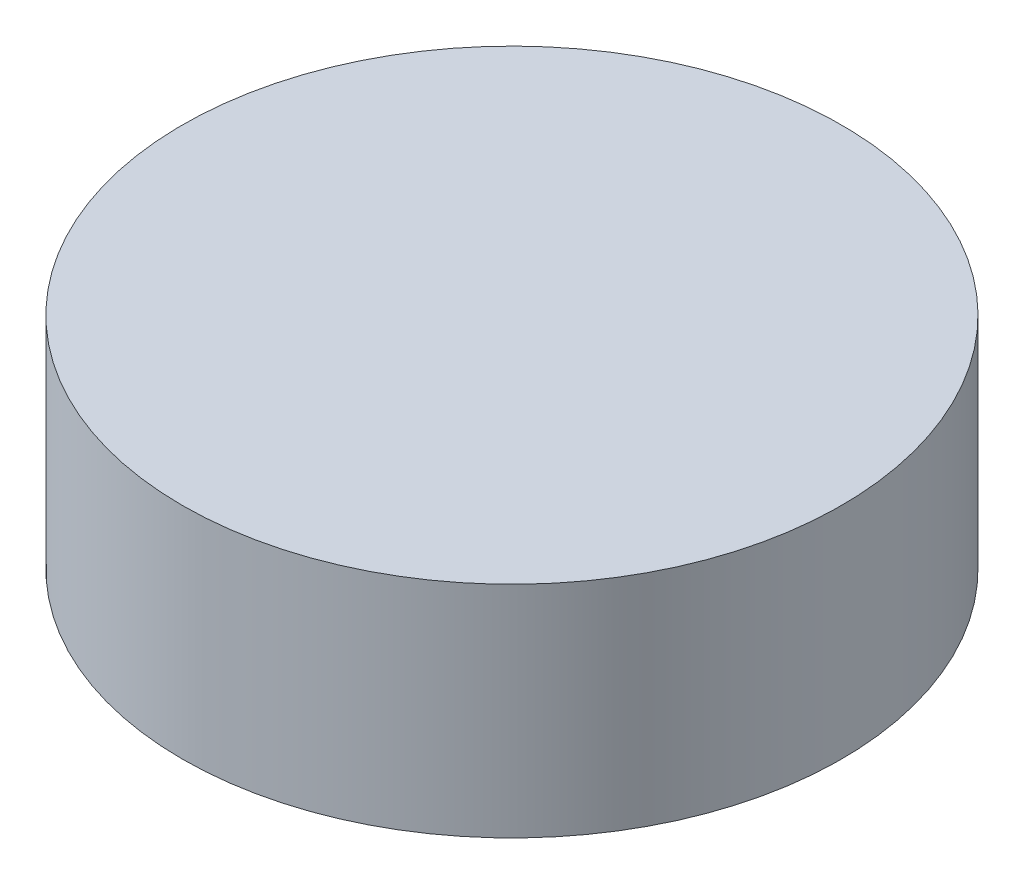
ISO-10303-21;
HEADER;
FILE_DESCRIPTION(('STEP AP214'),'2;1');
FILE_NAME('part.step','',(''),(''),'','','');
FILE_SCHEMA(('AUTOMOTIVE_DESIGN { 1 0 10303 214 1 1 1 1 }'));
ENDSEC;
DATA;
#1=APPLICATION_CONTEXT('core data for automotive mechanical design processes');
#2=APPLICATION_PROTOCOL_DEFINITION('international standard','automotive_design',2000,#1);
#3=PRODUCT_CONTEXT('',#1,'mechanical');
#4=PRODUCT('Part','Part','',(#3));
#5=PRODUCT_RELATED_PRODUCT_CATEGORY('part','',(#4));
#6=PRODUCT_DEFINITION_FORMATION('','',#4);
#7=PRODUCT_DEFINITION_CONTEXT('part definition',#1,'design');
#8=PRODUCT_DEFINITION('design','',#6,#7);
#9=PRODUCT_DEFINITION_SHAPE('','',#8);
#10=(LENGTH_UNIT() NAMED_UNIT(*) SI_UNIT(.MILLI.,.METRE.));
#11=(NAMED_UNIT(*) PLANE_ANGLE_UNIT() SI_UNIT($,.RADIAN.));
#12=(NAMED_UNIT(*) SI_UNIT($,.STERADIAN.) SOLID_ANGLE_UNIT());
#13=UNCERTAINTY_MEASURE_WITH_UNIT(LENGTH_MEASURE(1.E-05),#10,'distance_accuracy_value','');
#14=(GEOMETRIC_REPRESENTATION_CONTEXT(3) GLOBAL_UNCERTAINTY_ASSIGNED_CONTEXT((#13)) GLOBAL_UNIT_ASSIGNED_CONTEXT((#10,
#11,#12)) REPRESENTATION_CONTEXT('',''));
#15=CARTESIAN_POINT('',(0.,0.,0.));
#16=DIRECTION('',(0.,0.,1.));
#17=DIRECTION('',(1.,0.,0.));
#18=AXIS2_PLACEMENT_3D('',#15,#16,#17);
#19=CARTESIAN_POINT('',(0.,2.,0.));
#20=DIRECTION('',(0.,-1.,0.));
#21=DIRECTION('',(0.,0.,-1.));
#22=AXIS2_PLACEMENT_3D('',#19,#20,#21);
#23=CYLINDRICAL_SURFACE('',#22,3.);
#24=CARTESIAN_POINT('',(0.,2.,0.));
#25=DIRECTION('',(0.,1.,0.));
#26=DIRECTION('',(0.,0.,1.));
#27=AXIS2_PLACEMENT_3D('',#24,#25,#26);
#28=CIRCLE('',#27,3.);
#29=CARTESIAN_POINT('',(0.,2.,3.));
#30=VERTEX_POINT('',#29);
#31=EDGE_CURVE('E10',#30,#30,#28,.T.);
#32=ORIENTED_EDGE('',*,*,#31,.F.);
#33=EDGE_LOOP('',(#32));
#34=FACE_BOUND('',#33,.T.);
#35=CARTESIAN_POINT('',(0.,0.,0.));
#36=DIRECTION('',(0.,1.,0.));
#37=DIRECTION('',(0.,0.,1.));
#38=AXIS2_PLACEMENT_3D('',#35,#36,#37);
#39=CIRCLE('',#38,3.);
#40=CARTESIAN_POINT('',(0.,0.,3.));
#41=VERTEX_POINT('',#40);
#42=EDGE_CURVE('E34',#41,#41,#39,.T.);
#43=ORIENTED_EDGE('',*,*,#42,.T.);
#44=EDGE_LOOP('',(#43));
#45=FACE_BOUND('',#44,.T.);
#46=ADVANCED_FACE('F31',(#34,#45),#23,.T.);
#47=CARTESIAN_POINT('',(0.,2.,0.));
#48=DIRECTION('',(0.,1.,0.));
#49=DIRECTION('',(0.,0.,1.));
#50=AXIS2_PLACEMENT_3D('',#47,#48,#49);
#51=PLANE('',#50);
#52=ORIENTED_EDGE('',*,*,#31,.T.);
#53=EDGE_LOOP('',(#52));
#54=FACE_BOUND('',#53,.T.);
#55=ADVANCED_FACE('F46',(#54),#51,.T.);
#56=CARTESIAN_POINT('',(0.,0.,0.));
#57=DIRECTION('',(0.,1.,0.));
#58=DIRECTION('',(0.,0.,1.));
#59=AXIS2_PLACEMENT_3D('',#56,#57,#58);
#60=PLANE('',#59);
#61=ORIENTED_EDGE('',*,*,#42,.F.);
#62=EDGE_LOOP('',(#61));
#63=FACE_BOUND('',#62,.T.);
#64=ADVANCED_FACE('F44',(#63),#60,.F.);
#65=CLOSED_SHELL('',(#46,#55,#64));
#66=MANIFOLD_SOLID_BREP('B2',#65);
#67=ADVANCED_BREP_SHAPE_REPRESENTATION('',(#18,#66),#14);
#68=SHAPE_DEFINITION_REPRESENTATION(#9,#67);
ENDSEC;
END-ISO-10303-21;
